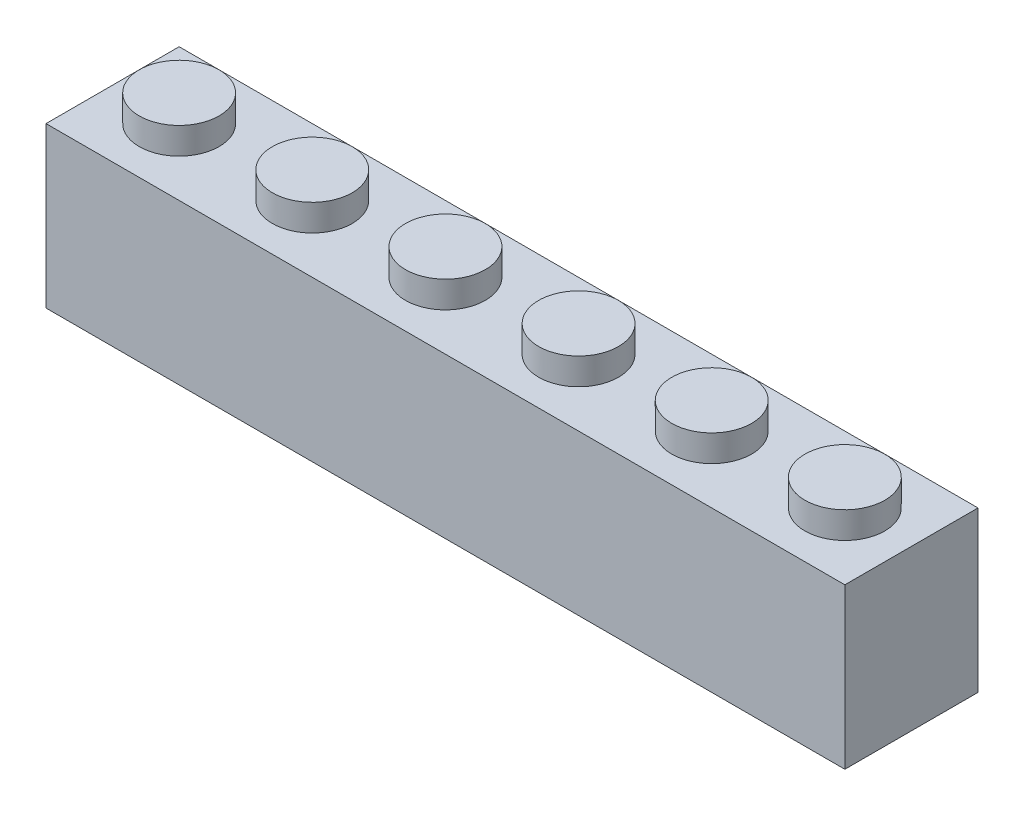
ISO-10303-21;
HEADER;
FILE_DESCRIPTION(('STEP AP214'),'2;1');
FILE_NAME('part.step','',(''),(''),'','','');
FILE_SCHEMA(('AUTOMOTIVE_DESIGN { 1 0 10303 214 1 1 1 1 }'));
ENDSEC;
DATA;
#1=APPLICATION_CONTEXT('core data for automotive mechanical design processes');
#2=APPLICATION_PROTOCOL_DEFINITION('international standard','automotive_design',2000,#1);
#3=PRODUCT_CONTEXT('',#1,'mechanical');
#4=PRODUCT('Part','Part','',(#3));
#5=PRODUCT_RELATED_PRODUCT_CATEGORY('part','',(#4));
#6=PRODUCT_DEFINITION_FORMATION('','',#4);
#7=PRODUCT_DEFINITION_CONTEXT('part definition',#1,'design');
#8=PRODUCT_DEFINITION('design','',#6,#7);
#9=PRODUCT_DEFINITION_SHAPE('','',#8);
#10=(LENGTH_UNIT() NAMED_UNIT(*) SI_UNIT(.MILLI.,.METRE.));
#11=(NAMED_UNIT(*) PLANE_ANGLE_UNIT() SI_UNIT($,.RADIAN.));
#12=(NAMED_UNIT(*) SI_UNIT($,.STERADIAN.) SOLID_ANGLE_UNIT());
#13=UNCERTAINTY_MEASURE_WITH_UNIT(LENGTH_MEASURE(1.E-05),#10,'distance_accuracy_value','');
#14=(GEOMETRIC_REPRESENTATION_CONTEXT(3) GLOBAL_UNCERTAINTY_ASSIGNED_CONTEXT((#13)) GLOBAL_UNIT_ASSIGNED_CONTEXT((#10,
#11,#12)) REPRESENTATION_CONTEXT('',''));
#15=CARTESIAN_POINT('',(0.,0.,0.));
#16=DIRECTION('',(0.,0.,1.));
#17=DIRECTION('',(1.,0.,0.));
#18=AXIS2_PLACEMENT_3D('',#15,#16,#17);
#19=CARTESIAN_POINT('',(44.,4.8,0.));
#20=DIRECTION('',(-1.,0.,0.));
#21=DIRECTION('',(0.,0.,1.));
#22=AXIS2_PLACEMENT_3D('',#19,#20,#21);
#23=PLANE('',#22);
#24=DIRECTION('',(0.,0.,-1.));
#25=VECTOR('',#24,1.);
#26=CARTESIAN_POINT('',(44.,0.,0.));
#27=LINE('',#26,#25);
#28=CARTESIAN_POINT('',(44.,0.,4.));
#29=VERTEX_POINT('',#28);
#30=CARTESIAN_POINT('',(44.,0.,-4.));
#31=VERTEX_POINT('',#30);
#32=EDGE_CURVE('E128',#29,#31,#27,.T.);
#33=ORIENTED_EDGE('',*,*,#32,.T.);
#34=DIRECTION('',(0.,-1.,0.));
#35=VECTOR('',#34,1.);
#36=CARTESIAN_POINT('',(44.,4.8,-4.));
#37=LINE('',#36,#35);
#38=CARTESIAN_POINT('',(44.,9.6,-4.));
#39=VERTEX_POINT('',#38);
#40=EDGE_CURVE('E137',#39,#31,#37,.T.);
#41=ORIENTED_EDGE('',*,*,#40,.F.);
#42=DIRECTION('',(0.,0.,-1.));
#43=VECTOR('',#42,1.);
#44=CARTESIAN_POINT('',(44.,9.6,0.));
#45=LINE('',#44,#43);
#46=CARTESIAN_POINT('',(44.,9.6,4.));
#47=VERTEX_POINT('',#46);
#48=EDGE_CURVE('E10',#47,#39,#45,.T.);
#49=ORIENTED_EDGE('',*,*,#48,.F.);
#50=DIRECTION('',(0.,1.,0.));
#51=VECTOR('',#50,1.);
#52=CARTESIAN_POINT('',(44.,4.8,4.));
#53=LINE('',#52,#51);
#54=EDGE_CURVE('E143',#29,#47,#53,.T.);
#55=ORIENTED_EDGE('',*,*,#54,.F.);
#56=EDGE_LOOP('',(#33,#41,#49,#55));
#57=FACE_BOUND('',#56,.T.);
#58=ADVANCED_FACE('F16',(#57),#23,.F.);
#59=CARTESIAN_POINT('',(20.,9.6,0.));
#60=DIRECTION('',(0.,-1.,0.));
#61=DIRECTION('',(0.,0.,-1.));
#62=AXIS2_PLACEMENT_3D('',#59,#60,#61);
#63=PLANE('',#62);
#64=ORIENTED_EDGE('',*,*,#48,.T.);
#65=DIRECTION('',(1.,0.,0.));
#66=VECTOR('',#65,1.);
#67=CARTESIAN_POINT('',(20.,9.6,-4.));
#68=LINE('',#67,#66);
#69=CARTESIAN_POINT('',(-4.,9.6,-4.));
#70=VERTEX_POINT('',#69);
#71=EDGE_CURVE('E129',#70,#39,#68,.T.);
#72=ORIENTED_EDGE('',*,*,#71,.F.);
#73=DIRECTION('',(0.,0.,-1.));
#74=VECTOR('',#73,1.);
#75=CARTESIAN_POINT('',(-4.,9.6,0.));
#76=LINE('',#75,#74);
#77=CARTESIAN_POINT('',(-4.,9.6,4.));
#78=VERTEX_POINT('',#77);
#79=EDGE_CURVE('E26',#78,#70,#76,.T.);
#80=ORIENTED_EDGE('',*,*,#79,.F.);
#81=DIRECTION('',(-1.,0.,0.));
#82=VECTOR('',#81,1.);
#83=CARTESIAN_POINT('',(20.,9.6,4.));
#84=LINE('',#83,#82);
#85=EDGE_CURVE('E141',#47,#78,#84,.T.);
#86=ORIENTED_EDGE('',*,*,#85,.F.);
#87=EDGE_LOOP('',(#64,#72,#80,#86));
#88=FACE_BOUND('',#87,.T.);
#89=CARTESIAN_POINT('',(0.,9.6,0.));
#90=DIRECTION('',(0.,-1.,0.));
#91=DIRECTION('',(1.,0.,0.));
#92=AXIS2_PLACEMENT_3D('',#89,#90,#91);
#93=CIRCLE('',#92,2.4);
#94=CARTESIAN_POINT('',(-2.4,9.6,0.));
#95=VERTEX_POINT('',#94);
#96=EDGE_CURVE('E174',#95,#95,#93,.T.);
#97=ORIENTED_EDGE('',*,*,#96,.T.);
#98=EDGE_LOOP('',(#97));
#99=FACE_BOUND('',#98,.T.);
#100=CARTESIAN_POINT('',(8.,9.6,0.));
#101=DIRECTION('',(0.,-1.,0.));
#102=DIRECTION('',(1.,0.,0.));
#103=AXIS2_PLACEMENT_3D('',#100,#101,#102);
#104=CIRCLE('',#103,2.4);
#105=CARTESIAN_POINT('',(5.6,9.6,0.));
#106=VERTEX_POINT('',#105);
#107=EDGE_CURVE('E191',#106,#106,#104,.T.);
#108=ORIENTED_EDGE('',*,*,#107,.T.);
#109=EDGE_LOOP('',(#108));
#110=FACE_BOUND('',#109,.T.);
#111=CARTESIAN_POINT('',(16.,9.6,0.));
#112=DIRECTION('',(0.,-1.,0.));
#113=DIRECTION('',(1.,0.,0.));
#114=AXIS2_PLACEMENT_3D('',#111,#112,#113);
#115=CIRCLE('',#114,2.4);
#116=CARTESIAN_POINT('',(13.6,9.6,0.));
#117=VERTEX_POINT('',#116);
#118=EDGE_CURVE('E188',#117,#117,#115,.T.);
#119=ORIENTED_EDGE('',*,*,#118,.T.);
#120=EDGE_LOOP('',(#119));
#121=FACE_BOUND('',#120,.T.);
#122=CARTESIAN_POINT('',(24.,9.6,0.));
#123=DIRECTION('',(0.,-1.,0.));
#124=DIRECTION('',(1.,0.,0.));
#125=AXIS2_PLACEMENT_3D('',#122,#123,#124);
#126=CIRCLE('',#125,2.4);
#127=CARTESIAN_POINT('',(21.6,9.6,0.));
#128=VERTEX_POINT('',#127);
#129=EDGE_CURVE('E152',#128,#128,#126,.T.);
#130=ORIENTED_EDGE('',*,*,#129,.T.);
#131=EDGE_LOOP('',(#130));
#132=FACE_BOUND('',#131,.T.);
#133=CARTESIAN_POINT('',(32.,9.6,0.));
#134=DIRECTION('',(0.,-1.,0.));
#135=DIRECTION('',(1.,0.,0.));
#136=AXIS2_PLACEMENT_3D('',#133,#134,#135);
#137=CIRCLE('',#136,2.4);
#138=CARTESIAN_POINT('',(29.6,9.6,0.));
#139=VERTEX_POINT('',#138);
#140=EDGE_CURVE('E153',#139,#139,#137,.T.);
#141=ORIENTED_EDGE('',*,*,#140,.T.);
#142=EDGE_LOOP('',(#141));
#143=FACE_BOUND('',#142,.T.);
#144=CARTESIAN_POINT('',(40.,9.6,0.));
#145=DIRECTION('',(0.,-1.,0.));
#146=DIRECTION('',(1.,0.,0.));
#147=AXIS2_PLACEMENT_3D('',#144,#145,#146);
#148=CIRCLE('',#147,2.4);
#149=CARTESIAN_POINT('',(37.6,9.6,0.));
#150=VERTEX_POINT('',#149);
#151=EDGE_CURVE('E178',#150,#150,#148,.T.);
#152=ORIENTED_EDGE('',*,*,#151,.T.);
#153=EDGE_LOOP('',(#152));
#154=FACE_BOUND('',#153,.T.);
#155=ADVANCED_FACE('F212',(#88,#99,#110,#121,#132,#143,#154),#63,.F.);
#156=CARTESIAN_POINT('',(-4.,4.8,0.));
#157=DIRECTION('',(1.,0.,0.));
#158=DIRECTION('',(0.,0.,-1.));
#159=AXIS2_PLACEMENT_3D('',#156,#157,#158);
#160=PLANE('',#159);
#161=ORIENTED_EDGE('',*,*,#79,.T.);
#162=DIRECTION('',(0.,1.,0.));
#163=VECTOR('',#162,1.);
#164=CARTESIAN_POINT('',(-4.,4.8,-4.));
#165=LINE('',#164,#163);
#166=CARTESIAN_POINT('',(-4.,0.,-4.));
#167=VERTEX_POINT('',#166);
#168=EDGE_CURVE('E124',#167,#70,#165,.T.);
#169=ORIENTED_EDGE('',*,*,#168,.F.);
#170=DIRECTION('',(0.,0.,-1.));
#171=VECTOR('',#170,1.);
#172=CARTESIAN_POINT('',(-4.,0.,0.));
#173=LINE('',#172,#171);
#174=CARTESIAN_POINT('',(-4.,0.,4.));
#175=VERTEX_POINT('',#174);
#176=EDGE_CURVE('E20',#175,#167,#173,.T.);
#177=ORIENTED_EDGE('',*,*,#176,.F.);
#178=DIRECTION('',(0.,-1.,0.));
#179=VECTOR('',#178,1.);
#180=CARTESIAN_POINT('',(-4.,4.8,4.));
#181=LINE('',#180,#179);
#182=EDGE_CURVE('E121',#78,#175,#181,.T.);
#183=ORIENTED_EDGE('',*,*,#182,.F.);
#184=EDGE_LOOP('',(#161,#169,#177,#183));
#185=FACE_BOUND('',#184,.T.);
#186=ADVANCED_FACE('F119',(#185),#160,.F.);
#187=CARTESIAN_POINT('',(20.,0.,0.));
#188=DIRECTION('',(0.,1.,0.));
#189=DIRECTION('',(0.,0.,1.));
#190=AXIS2_PLACEMENT_3D('',#187,#188,#189);
#191=PLANE('',#190);
#192=ORIENTED_EDGE('',*,*,#176,.T.);
#193=DIRECTION('',(-1.,0.,0.));
#194=VECTOR('',#193,1.);
#195=CARTESIAN_POINT('',(20.,0.,-4.));
#196=LINE('',#195,#194);
#197=EDGE_CURVE('E149',#31,#167,#196,.T.);
#198=ORIENTED_EDGE('',*,*,#197,.F.);
#199=ORIENTED_EDGE('',*,*,#32,.F.);
#200=DIRECTION('',(1.,0.,0.));
#201=VECTOR('',#200,1.);
#202=CARTESIAN_POINT('',(20.,0.,4.));
#203=LINE('',#202,#201);
#204=EDGE_CURVE('E131',#175,#29,#203,.T.);
#205=ORIENTED_EDGE('',*,*,#204,.F.);
#206=EDGE_LOOP('',(#192,#198,#199,#205));
#207=FACE_BOUND('',#206,.T.);
#208=CARTESIAN_POINT('',(0.,0.,0.));
#209=DIRECTION('',(0.,1.,0.));
#210=DIRECTION('',(1.,0.,0.));
#211=AXIS2_PLACEMENT_3D('',#208,#209,#210);
#212=CIRCLE('',#211,2.4);
#213=CARTESIAN_POINT('',(-2.4,0.,0.));
#214=VERTEX_POINT('',#213);
#215=EDGE_CURVE('E167',#214,#214,#212,.T.);
#216=ORIENTED_EDGE('',*,*,#215,.T.);
#217=EDGE_LOOP('',(#216));
#218=FACE_BOUND('',#217,.T.);
#219=CARTESIAN_POINT('',(8.,0.,0.));
#220=DIRECTION('',(0.,1.,0.));
#221=DIRECTION('',(1.,0.,0.));
#222=AXIS2_PLACEMENT_3D('',#219,#220,#221);
#223=CIRCLE('',#222,2.4);
#224=CARTESIAN_POINT('',(5.6,0.,0.));
#225=VERTEX_POINT('',#224);
#226=EDGE_CURVE('E160',#225,#225,#223,.T.);
#227=ORIENTED_EDGE('',*,*,#226,.T.);
#228=EDGE_LOOP('',(#227));
#229=FACE_BOUND('',#228,.T.);
#230=CARTESIAN_POINT('',(16.,0.,0.));
#231=DIRECTION('',(0.,1.,0.));
#232=DIRECTION('',(1.,0.,0.));
#233=AXIS2_PLACEMENT_3D('',#230,#231,#232);
#234=CIRCLE('',#233,2.4);
#235=CARTESIAN_POINT('',(13.6,0.,0.));
#236=VERTEX_POINT('',#235);
#237=EDGE_CURVE('E193',#236,#236,#234,.T.);
#238=ORIENTED_EDGE('',*,*,#237,.T.);
#239=EDGE_LOOP('',(#238));
#240=FACE_BOUND('',#239,.T.);
#241=CARTESIAN_POINT('',(24.,0.,0.));
#242=DIRECTION('',(0.,1.,0.));
#243=DIRECTION('',(1.,0.,0.));
#244=AXIS2_PLACEMENT_3D('',#241,#242,#243);
#245=CIRCLE('',#244,2.4);
#246=CARTESIAN_POINT('',(21.6,0.,0.));
#247=VERTEX_POINT('',#246);
#248=EDGE_CURVE('E156',#247,#247,#245,.T.);
#249=ORIENTED_EDGE('',*,*,#248,.T.);
#250=EDGE_LOOP('',(#249));
#251=FACE_BOUND('',#250,.T.);
#252=CARTESIAN_POINT('',(32.,0.,0.));
#253=DIRECTION('',(0.,1.,0.));
#254=DIRECTION('',(1.,0.,0.));
#255=AXIS2_PLACEMENT_3D('',#252,#253,#254);
#256=CIRCLE('',#255,2.4);
#257=CARTESIAN_POINT('',(29.6,0.,0.));
#258=VERTEX_POINT('',#257);
#259=EDGE_CURVE('E157',#258,#258,#256,.T.);
#260=ORIENTED_EDGE('',*,*,#259,.T.);
#261=EDGE_LOOP('',(#260));
#262=FACE_BOUND('',#261,.T.);
#263=CARTESIAN_POINT('',(40.,0.,0.));
#264=DIRECTION('',(0.,1.,0.));
#265=DIRECTION('',(1.,0.,0.));
#266=AXIS2_PLACEMENT_3D('',#263,#264,#265);
#267=CIRCLE('',#266,2.4);
#268=CARTESIAN_POINT('',(37.6,0.,0.));
#269=VERTEX_POINT('',#268);
#270=EDGE_CURVE('E173',#269,#269,#267,.T.);
#271=ORIENTED_EDGE('',*,*,#270,.T.);
#272=EDGE_LOOP('',(#271));
#273=FACE_BOUND('',#272,.T.);
#274=ADVANCED_FACE('F132',(#207,#218,#229,#240,#251,#262,#273),#191,.F.);
#275=CARTESIAN_POINT('',(20.,4.8,-4.));
#276=DIRECTION('',(0.,0.,1.));
#277=DIRECTION('',(1.,0.,0.));
#278=AXIS2_PLACEMENT_3D('',#275,#276,#277);
#279=PLANE('',#278);
#280=ORIENTED_EDGE('',*,*,#40,.T.);
#281=ORIENTED_EDGE('',*,*,#197,.T.);
#282=ORIENTED_EDGE('',*,*,#168,.T.);
#283=ORIENTED_EDGE('',*,*,#71,.T.);
#284=EDGE_LOOP('',(#280,#281,#282,#283));
#285=FACE_BOUND('',#284,.T.);
#286=ADVANCED_FACE('F215',(#285),#279,.F.);
#287=CARTESIAN_POINT('',(20.,4.8,4.));
#288=DIRECTION('',(0.,0.,1.));
#289=DIRECTION('',(1.,0.,0.));
#290=AXIS2_PLACEMENT_3D('',#287,#288,#289);
#291=PLANE('',#290);
#292=ORIENTED_EDGE('',*,*,#54,.T.);
#293=ORIENTED_EDGE('',*,*,#85,.T.);
#294=ORIENTED_EDGE('',*,*,#182,.T.);
#295=ORIENTED_EDGE('',*,*,#204,.T.);
#296=EDGE_LOOP('',(#292,#293,#294,#295));
#297=FACE_BOUND('',#296,.T.);
#298=ADVANCED_FACE('F139',(#297),#291,.T.);
#299=CARTESIAN_POINT('',(0.,11.2,0.));
#300=DIRECTION('',(0.,1.,0.));
#301=DIRECTION('',(1.,0.,0.));
#302=AXIS2_PLACEMENT_3D('',#299,#300,#301);
#303=PLANE('',#302);
#304=CARTESIAN_POINT('',(0.,11.2,0.));
#305=DIRECTION('',(0.,1.,0.));
#306=DIRECTION('',(1.,0.,0.));
#307=AXIS2_PLACEMENT_3D('',#304,#305,#306);
#308=CIRCLE('',#307,2.4);
#309=CARTESIAN_POINT('',(2.4,11.2,0.));
#310=VERTEX_POINT('',#309);
#311=EDGE_CURVE('E176',#310,#310,#308,.T.);
#312=ORIENTED_EDGE('',*,*,#311,.T.);
#313=EDGE_LOOP('',(#312));
#314=FACE_BOUND('',#313,.T.);
#315=ADVANCED_FACE('F223',(#314),#303,.T.);
#316=CARTESIAN_POINT('',(0.,10.15,0.));
#317=DIRECTION('',(0.,-1.,0.));
#318=DIRECTION('',(1.,0.,0.));
#319=AXIS2_PLACEMENT_3D('',#316,#317,#318);
#320=CYLINDRICAL_SURFACE('',#319,2.4);
#321=ORIENTED_EDGE('',*,*,#96,.F.);
#322=EDGE_LOOP('',(#321));
#323=FACE_BOUND('',#322,.T.);
#324=ORIENTED_EDGE('',*,*,#311,.F.);
#325=EDGE_LOOP('',(#324));
#326=FACE_BOUND('',#325,.T.);
#327=ADVANCED_FACE('F277',(#323,#326),#320,.T.);
#328=CARTESIAN_POINT('',(8.,11.2,0.));
#329=DIRECTION('',(0.,1.,0.));
#330=DIRECTION('',(1.,0.,0.));
#331=AXIS2_PLACEMENT_3D('',#328,#329,#330);
#332=PLANE('',#331);
#333=CARTESIAN_POINT('',(8.,11.2,0.));
#334=DIRECTION('',(0.,1.,0.));
#335=DIRECTION('',(1.,0.,0.));
#336=AXIS2_PLACEMENT_3D('',#333,#334,#335);
#337=CIRCLE('',#336,2.4);
#338=CARTESIAN_POINT('',(10.4,11.2,0.));
#339=VERTEX_POINT('',#338);
#340=EDGE_CURVE('E189',#339,#339,#337,.T.);
#341=ORIENTED_EDGE('',*,*,#340,.T.);
#342=EDGE_LOOP('',(#341));
#343=FACE_BOUND('',#342,.T.);
#344=ADVANCED_FACE('F275',(#343),#332,.T.);
#345=CARTESIAN_POINT('',(8.,10.15,0.));
#346=DIRECTION('',(0.,-1.,0.));
#347=DIRECTION('',(1.,0.,0.));
#348=AXIS2_PLACEMENT_3D('',#345,#346,#347);
#349=CYLINDRICAL_SURFACE('',#348,2.4);
#350=ORIENTED_EDGE('',*,*,#107,.F.);
#351=EDGE_LOOP('',(#350));
#352=FACE_BOUND('',#351,.T.);
#353=ORIENTED_EDGE('',*,*,#340,.F.);
#354=EDGE_LOOP('',(#353));
#355=FACE_BOUND('',#354,.T.);
#356=ADVANCED_FACE('F245',(#352,#355),#349,.T.);
#357=CARTESIAN_POINT('',(16.,11.2,0.));
#358=DIRECTION('',(0.,1.,0.));
#359=DIRECTION('',(1.,0.,0.));
#360=AXIS2_PLACEMENT_3D('',#357,#358,#359);
#361=PLANE('',#360);
#362=CARTESIAN_POINT('',(16.,11.2,0.));
#363=DIRECTION('',(0.,1.,0.));
#364=DIRECTION('',(1.,0.,0.));
#365=AXIS2_PLACEMENT_3D('',#362,#363,#364);
#366=CIRCLE('',#365,2.4);
#367=CARTESIAN_POINT('',(18.4,11.2,0.));
#368=VERTEX_POINT('',#367);
#369=EDGE_CURVE('E186',#368,#368,#366,.T.);
#370=ORIENTED_EDGE('',*,*,#369,.T.);
#371=EDGE_LOOP('',(#370));
#372=FACE_BOUND('',#371,.T.);
#373=ADVANCED_FACE('F242',(#372),#361,.T.);
#374=CARTESIAN_POINT('',(16.,10.15,0.));
#375=DIRECTION('',(0.,-1.,0.));
#376=DIRECTION('',(1.,0.,0.));
#377=AXIS2_PLACEMENT_3D('',#374,#375,#376);
#378=CYLINDRICAL_SURFACE('',#377,2.4);
#379=ORIENTED_EDGE('',*,*,#118,.F.);
#380=EDGE_LOOP('',(#379));
#381=FACE_BOUND('',#380,.T.);
#382=ORIENTED_EDGE('',*,*,#369,.F.);
#383=EDGE_LOOP('',(#382));
#384=FACE_BOUND('',#383,.T.);
#385=ADVANCED_FACE('F244',(#381,#384),#378,.T.);
#386=CARTESIAN_POINT('',(24.,11.2,0.));
#387=DIRECTION('',(0.,1.,0.));
#388=DIRECTION('',(1.,0.,0.));
#389=AXIS2_PLACEMENT_3D('',#386,#387,#388);
#390=PLANE('',#389);
#391=CARTESIAN_POINT('',(24.,11.2,0.));
#392=DIRECTION('',(0.,1.,0.));
#393=DIRECTION('',(1.,0.,0.));
#394=AXIS2_PLACEMENT_3D('',#391,#392,#393);
#395=CIRCLE('',#394,2.4);
#396=CARTESIAN_POINT('',(26.4,11.2,0.));
#397=VERTEX_POINT('',#396);
#398=EDGE_CURVE('E150',#397,#397,#395,.T.);
#399=ORIENTED_EDGE('',*,*,#398,.T.);
#400=EDGE_LOOP('',(#399));
#401=FACE_BOUND('',#400,.T.);
#402=ADVANCED_FACE('F273',(#401),#390,.T.);
#403=CARTESIAN_POINT('',(24.,10.15,0.));
#404=DIRECTION('',(0.,-1.,0.));
#405=DIRECTION('',(1.,0.,0.));
#406=AXIS2_PLACEMENT_3D('',#403,#404,#405);
#407=CYLINDRICAL_SURFACE('',#406,2.4);
#408=ORIENTED_EDGE('',*,*,#129,.F.);
#409=EDGE_LOOP('',(#408));
#410=FACE_BOUND('',#409,.T.);
#411=ORIENTED_EDGE('',*,*,#398,.F.);
#412=EDGE_LOOP('',(#411));
#413=FACE_BOUND('',#412,.T.);
#414=ADVANCED_FACE('F355',(#410,#413),#407,.T.);
#415=CARTESIAN_POINT('',(32.,11.2,0.));
#416=DIRECTION('',(0.,1.,0.));
#417=DIRECTION('',(1.,0.,0.));
#418=AXIS2_PLACEMENT_3D('',#415,#416,#417);
#419=PLANE('',#418);
#420=CARTESIAN_POINT('',(32.,11.2,0.));
#421=DIRECTION('',(0.,1.,0.));
#422=DIRECTION('',(1.,0.,0.));
#423=AXIS2_PLACEMENT_3D('',#420,#421,#422);
#424=CIRCLE('',#423,2.4);
#425=CARTESIAN_POINT('',(34.4,11.2,0.));
#426=VERTEX_POINT('',#425);
#427=EDGE_CURVE('E159',#426,#426,#424,.T.);
#428=ORIENTED_EDGE('',*,*,#427,.T.);
#429=EDGE_LOOP('',(#428));
#430=FACE_BOUND('',#429,.T.);
#431=ADVANCED_FACE('F364',(#430),#419,.T.);
#432=CARTESIAN_POINT('',(32.,10.15,0.));
#433=DIRECTION('',(0.,-1.,0.));
#434=DIRECTION('',(1.,0.,0.));
#435=AXIS2_PLACEMENT_3D('',#432,#433,#434);
#436=CYLINDRICAL_SURFACE('',#435,2.4);
#437=ORIENTED_EDGE('',*,*,#140,.F.);
#438=EDGE_LOOP('',(#437));
#439=FACE_BOUND('',#438,.T.);
#440=ORIENTED_EDGE('',*,*,#427,.F.);
#441=EDGE_LOOP('',(#440));
#442=FACE_BOUND('',#441,.T.);
#443=ADVANCED_FACE('F374',(#439,#442),#436,.T.);
#444=CARTESIAN_POINT('',(40.,11.2,0.));
#445=DIRECTION('',(0.,1.,0.));
#446=DIRECTION('',(1.,0.,0.));
#447=AXIS2_PLACEMENT_3D('',#444,#445,#446);
#448=PLANE('',#447);
#449=CARTESIAN_POINT('',(40.,11.2,0.));
#450=DIRECTION('',(0.,1.,0.));
#451=DIRECTION('',(1.,0.,0.));
#452=AXIS2_PLACEMENT_3D('',#449,#450,#451);
#453=CIRCLE('',#452,2.4);
#454=CARTESIAN_POINT('',(42.4,11.2,0.));
#455=VERTEX_POINT('',#454);
#456=EDGE_CURVE('E166',#455,#455,#453,.T.);
#457=ORIENTED_EDGE('',*,*,#456,.T.);
#458=EDGE_LOOP('',(#457));
#459=FACE_BOUND('',#458,.T.);
#460=ADVANCED_FACE('F384',(#459),#448,.T.);
#461=CARTESIAN_POINT('',(40.,10.15,0.));
#462=DIRECTION('',(0.,-1.,0.));
#463=DIRECTION('',(1.,0.,0.));
#464=AXIS2_PLACEMENT_3D('',#461,#462,#463);
#465=CYLINDRICAL_SURFACE('',#464,2.4);
#466=ORIENTED_EDGE('',*,*,#151,.F.);
#467=EDGE_LOOP('',(#466));
#468=FACE_BOUND('',#467,.T.);
#469=ORIENTED_EDGE('',*,*,#456,.F.);
#470=EDGE_LOOP('',(#469));
#471=FACE_BOUND('',#470,.T.);
#472=ADVANCED_FACE('F266',(#468,#471),#465,.T.);
#473=CARTESIAN_POINT('',(0.,1.6,0.));
#474=DIRECTION('',(0.,1.,0.));
#475=DIRECTION('',(1.,0.,0.));
#476=AXIS2_PLACEMENT_3D('',#473,#474,#475);
#477=PLANE('',#476);
#478=CARTESIAN_POINT('',(0.,1.6,0.));
#479=DIRECTION('',(0.,1.,0.));
#480=DIRECTION('',(1.,0.,0.));
#481=AXIS2_PLACEMENT_3D('',#478,#479,#480);
#482=CIRCLE('',#481,2.4);
#483=CARTESIAN_POINT('',(2.4,1.6,0.));
#484=VERTEX_POINT('',#483);
#485=EDGE_CURVE('E164',#484,#484,#482,.T.);
#486=ORIENTED_EDGE('',*,*,#485,.F.);
#487=EDGE_LOOP('',(#486));
#488=FACE_BOUND('',#487,.T.);
#489=ADVANCED_FACE('F262',(#488),#477,.F.);
#490=CARTESIAN_POINT('',(0.,0.55,0.));
#491=DIRECTION('',(0.,-1.,0.));
#492=DIRECTION('',(1.,0.,0.));
#493=AXIS2_PLACEMENT_3D('',#490,#491,#492);
#494=CYLINDRICAL_SURFACE('',#493,2.4);
#495=ORIENTED_EDGE('',*,*,#485,.T.);
#496=EDGE_LOOP('',(#495));
#497=FACE_BOUND('',#496,.T.);
#498=ORIENTED_EDGE('',*,*,#215,.F.);
#499=EDGE_LOOP('',(#498));
#500=FACE_BOUND('',#499,.T.);
#501=ADVANCED_FACE('F265',(#497,#500),#494,.F.);
#502=CARTESIAN_POINT('',(8.,1.6,0.));
#503=DIRECTION('',(0.,1.,0.));
#504=DIRECTION('',(1.,0.,0.));
#505=AXIS2_PLACEMENT_3D('',#502,#503,#504);
#506=PLANE('',#505);
#507=CARTESIAN_POINT('',(8.,1.6,0.));
#508=DIRECTION('',(0.,1.,0.));
#509=DIRECTION('',(1.,0.,0.));
#510=AXIS2_PLACEMENT_3D('',#507,#508,#509);
#511=CIRCLE('',#510,2.4);
#512=CARTESIAN_POINT('',(10.4,1.6,0.));
#513=VERTEX_POINT('',#512);
#514=EDGE_CURVE('E162',#513,#513,#511,.T.);
#515=ORIENTED_EDGE('',*,*,#514,.F.);
#516=EDGE_LOOP('',(#515));
#517=FACE_BOUND('',#516,.T.);
#518=ADVANCED_FACE('F256',(#517),#506,.F.);
#519=CARTESIAN_POINT('',(8.,0.55,0.));
#520=DIRECTION('',(0.,-1.,0.));
#521=DIRECTION('',(1.,0.,0.));
#522=AXIS2_PLACEMENT_3D('',#519,#520,#521);
#523=CYLINDRICAL_SURFACE('',#522,2.4);
#524=ORIENTED_EDGE('',*,*,#514,.T.);
#525=EDGE_LOOP('',(#524));
#526=FACE_BOUND('',#525,.T.);
#527=ORIENTED_EDGE('',*,*,#226,.F.);
#528=EDGE_LOOP('',(#527));
#529=FACE_BOUND('',#528,.T.);
#530=ADVANCED_FACE('F253',(#526,#529),#523,.F.);
#531=CARTESIAN_POINT('',(16.,1.6,0.));
#532=DIRECTION('',(0.,1.,0.));
#533=DIRECTION('',(1.,0.,0.));
#534=AXIS2_PLACEMENT_3D('',#531,#532,#533);
#535=PLANE('',#534);
#536=CARTESIAN_POINT('',(16.,1.6,0.));
#537=DIRECTION('',(0.,1.,0.));
#538=DIRECTION('',(1.,0.,0.));
#539=AXIS2_PLACEMENT_3D('',#536,#537,#538);
#540=CIRCLE('',#539,2.4);
#541=CARTESIAN_POINT('',(18.4,1.6,0.));
#542=VERTEX_POINT('',#541);
#543=EDGE_CURVE('E163',#542,#542,#540,.T.);
#544=ORIENTED_EDGE('',*,*,#543,.F.);
#545=EDGE_LOOP('',(#544));
#546=FACE_BOUND('',#545,.T.);
#547=ADVANCED_FACE('F18',(#546),#535,.F.);
#548=CARTESIAN_POINT('',(16.,0.55,0.));
#549=DIRECTION('',(0.,-1.,0.));
#550=DIRECTION('',(1.,0.,0.));
#551=AXIS2_PLACEMENT_3D('',#548,#549,#550);
#552=CYLINDRICAL_SURFACE('',#551,2.4);
#553=ORIENTED_EDGE('',*,*,#543,.T.);
#554=EDGE_LOOP('',(#553));
#555=FACE_BOUND('',#554,.T.);
#556=ORIENTED_EDGE('',*,*,#237,.F.);
#557=EDGE_LOOP('',(#556));
#558=FACE_BOUND('',#557,.T.);
#559=ADVANCED_FACE('F442',(#555,#558),#552,.F.);
#560=CARTESIAN_POINT('',(24.,1.6,0.));
#561=DIRECTION('',(0.,1.,0.));
#562=DIRECTION('',(1.,0.,0.));
#563=AXIS2_PLACEMENT_3D('',#560,#561,#562);
#564=PLANE('',#563);
#565=CARTESIAN_POINT('',(24.,1.6,0.));
#566=DIRECTION('',(0.,1.,0.));
#567=DIRECTION('',(1.,0.,0.));
#568=AXIS2_PLACEMENT_3D('',#565,#566,#567);
#569=CIRCLE('',#568,2.4);
#570=CARTESIAN_POINT('',(26.4,1.6,0.));
#571=VERTEX_POINT('',#570);
#572=EDGE_CURVE('E183',#571,#571,#569,.T.);
#573=ORIENTED_EDGE('',*,*,#572,.F.);
#574=EDGE_LOOP('',(#573));
#575=FACE_BOUND('',#574,.T.);
#576=ADVANCED_FACE('F240',(#575),#564,.F.);
#577=CARTESIAN_POINT('',(24.,0.55,0.));
#578=DIRECTION('',(0.,-1.,0.));
#579=DIRECTION('',(1.,0.,0.));
#580=AXIS2_PLACEMENT_3D('',#577,#578,#579);
#581=CYLINDRICAL_SURFACE('',#580,2.4);
#582=ORIENTED_EDGE('',*,*,#572,.T.);
#583=EDGE_LOOP('',(#582));
#584=FACE_BOUND('',#583,.T.);
#585=ORIENTED_EDGE('',*,*,#248,.F.);
#586=EDGE_LOOP('',(#585));
#587=FACE_BOUND('',#586,.T.);
#588=ADVANCED_FACE('F236',(#584,#587),#581,.F.);
#589=CARTESIAN_POINT('',(32.,1.6,0.));
#590=DIRECTION('',(0.,1.,0.));
#591=DIRECTION('',(1.,0.,0.));
#592=AXIS2_PLACEMENT_3D('',#589,#590,#591);
#593=PLANE('',#592);
#594=CARTESIAN_POINT('',(32.,1.6,0.));
#595=DIRECTION('',(0.,1.,0.));
#596=DIRECTION('',(1.,0.,0.));
#597=AXIS2_PLACEMENT_3D('',#594,#595,#596);
#598=CIRCLE('',#597,2.4);
#599=CARTESIAN_POINT('',(34.4,1.6,0.));
#600=VERTEX_POINT('',#599);
#601=EDGE_CURVE('E154',#600,#600,#598,.T.);
#602=ORIENTED_EDGE('',*,*,#601,.F.);
#603=EDGE_LOOP('',(#602));
#604=FACE_BOUND('',#603,.T.);
#605=ADVANCED_FACE('F239',(#604),#593,.F.);
#606=CARTESIAN_POINT('',(32.,0.55,0.));
#607=DIRECTION('',(0.,-1.,0.));
#608=DIRECTION('',(1.,0.,0.));
#609=AXIS2_PLACEMENT_3D('',#606,#607,#608);
#610=CYLINDRICAL_SURFACE('',#609,2.4);
#611=ORIENTED_EDGE('',*,*,#601,.T.);
#612=EDGE_LOOP('',(#611));
#613=FACE_BOUND('',#612,.T.);
#614=ORIENTED_EDGE('',*,*,#259,.F.);
#615=EDGE_LOOP('',(#614));
#616=FACE_BOUND('',#615,.T.);
#617=ADVANCED_FACE('F258',(#613,#616),#610,.F.);
#618=CARTESIAN_POINT('',(40.,1.6,0.));
#619=DIRECTION('',(0.,1.,0.));
#620=DIRECTION('',(1.,0.,0.));
#621=AXIS2_PLACEMENT_3D('',#618,#619,#620);
#622=PLANE('',#621);
#623=CARTESIAN_POINT('',(40.,1.6,0.));
#624=DIRECTION('',(0.,1.,0.));
#625=DIRECTION('',(1.,0.,0.));
#626=AXIS2_PLACEMENT_3D('',#623,#624,#625);
#627=CIRCLE('',#626,2.4);
#628=CARTESIAN_POINT('',(42.4,1.6,0.));
#629=VERTEX_POINT('',#628);
#630=EDGE_CURVE('E171',#629,#629,#627,.T.);
#631=ORIENTED_EDGE('',*,*,#630,.F.);
#632=EDGE_LOOP('',(#631));
#633=FACE_BOUND('',#632,.T.);
#634=ADVANCED_FACE('F251',(#633),#622,.F.);
#635=CARTESIAN_POINT('',(40.,0.55,0.));
#636=DIRECTION('',(0.,-1.,0.));
#637=DIRECTION('',(1.,0.,0.));
#638=AXIS2_PLACEMENT_3D('',#635,#636,#637);
#639=CYLINDRICAL_SURFACE('',#638,2.4);
#640=ORIENTED_EDGE('',*,*,#630,.T.);
#641=EDGE_LOOP('',(#640));
#642=FACE_BOUND('',#641,.T.);
#643=ORIENTED_EDGE('',*,*,#270,.F.);
#644=EDGE_LOOP('',(#643));
#645=FACE_BOUND('',#644,.T.);
#646=ADVANCED_FACE('F248',(#642,#645),#639,.F.);
#647=CLOSED_SHELL('',(#58,#155,#186,#274,#286,#298,#315,#327,#344,#356,#373,#385,#402,#414,#431,
#443,#460,#472,#489,#501,#518,#530,#547,#559,#576,#588,#605,#617,#634,#646));
#648=MANIFOLD_SOLID_BREP('B1',#647);
#649=ADVANCED_BREP_SHAPE_REPRESENTATION('',(#18,#648),#14);
#650=SHAPE_DEFINITION_REPRESENTATION(#9,#649);
ENDSEC;
END-ISO-10303-21;
